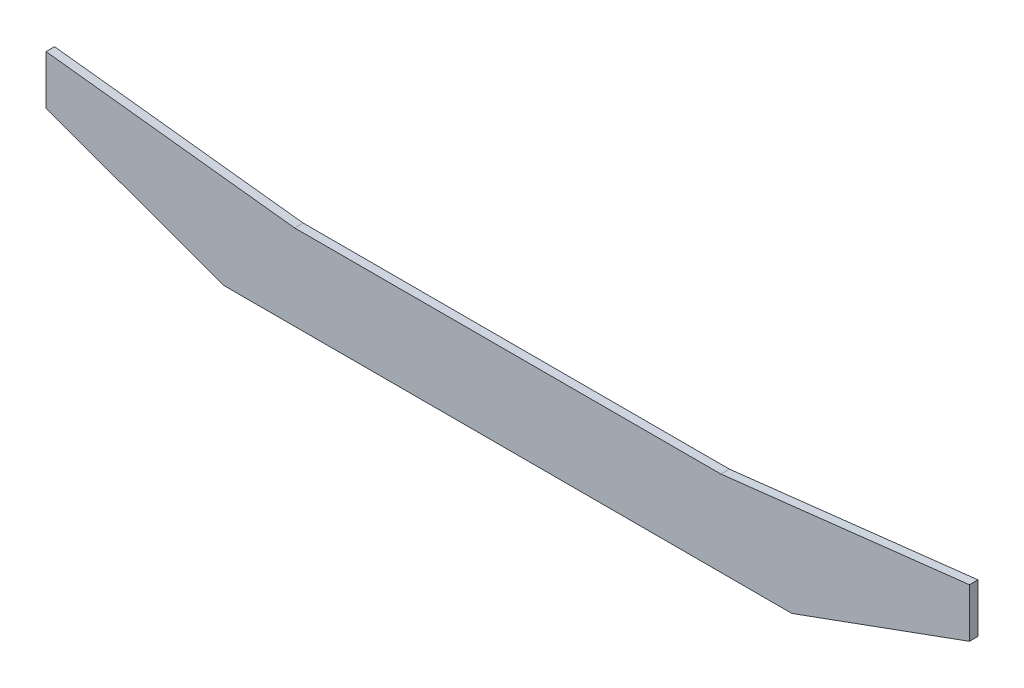
ISO-10303-21;
HEADER;
FILE_DESCRIPTION(('STEP AP214'),'2;1');
FILE_NAME('part.step','',(''),(''),'','','');
FILE_SCHEMA(('AUTOMOTIVE_DESIGN { 1 0 10303 214 1 1 1 1 }'));
ENDSEC;
DATA;
#1=APPLICATION_CONTEXT('core data for automotive mechanical design processes');
#2=APPLICATION_PROTOCOL_DEFINITION('international standard','automotive_design',2000,#1);
#3=PRODUCT_CONTEXT('',#1,'mechanical');
#4=PRODUCT('Part','Part','',(#3));
#5=PRODUCT_RELATED_PRODUCT_CATEGORY('part','',(#4));
#6=PRODUCT_DEFINITION_FORMATION('','',#4);
#7=PRODUCT_DEFINITION_CONTEXT('part definition',#1,'design');
#8=PRODUCT_DEFINITION('design','',#6,#7);
#9=PRODUCT_DEFINITION_SHAPE('','',#8);
#10=(LENGTH_UNIT() NAMED_UNIT(*) SI_UNIT(.MILLI.,.METRE.));
#11=(NAMED_UNIT(*) PLANE_ANGLE_UNIT() SI_UNIT($,.RADIAN.));
#12=(NAMED_UNIT(*) SI_UNIT($,.STERADIAN.) SOLID_ANGLE_UNIT());
#13=UNCERTAINTY_MEASURE_WITH_UNIT(LENGTH_MEASURE(1.E-05),#10,'distance_accuracy_value','');
#14=(GEOMETRIC_REPRESENTATION_CONTEXT(3) GLOBAL_UNCERTAINTY_ASSIGNED_CONTEXT((#13)) GLOBAL_UNIT_ASSIGNED_CONTEXT((#10,
#11,#12)) REPRESENTATION_CONTEXT('',''));
#15=CARTESIAN_POINT('',(0.,0.,0.));
#16=DIRECTION('',(0.,0.,1.));
#17=DIRECTION('',(1.,0.,0.));
#18=AXIS2_PLACEMENT_3D('',#15,#16,#17);
#19=CARTESIAN_POINT('',(-325.,79.9999999999999,6.));
#20=DIRECTION('',(-0.113546591160732,-0.993532672656404,0.));
#21=DIRECTION('',(0.993532672656404,-0.113546591160732,0.));
#22=AXIS2_PLACEMENT_3D('',#19,#20,#21);
#23=PLANE('',#22);
#24=DIRECTION('',(-0.993532672656404,0.113546591160732,0.));
#25=VECTOR('',#24,1.);
#26=CARTESIAN_POINT('',(-325.,79.9999999999999,0.));
#27=LINE('',#26,#25);
#28=CARTESIAN_POINT('',(-150.,60.,0.));
#29=VERTEX_POINT('',#28);
#30=CARTESIAN_POINT('',(-325.,79.9999999999999,0.));
#31=VERTEX_POINT('',#30);
#32=EDGE_CURVE('E131',#29,#31,#27,.T.);
#33=ORIENTED_EDGE('',*,*,#32,.T.);
#34=DIRECTION('',(0.,0.,-1.));
#35=VECTOR('',#34,1.);
#36=CARTESIAN_POINT('',(-325.,79.9999999999999,6.));
#37=LINE('',#36,#35);
#38=CARTESIAN_POINT('',(-325.,79.9999999999999,6.));
#39=VERTEX_POINT('',#38);
#40=EDGE_CURVE('E11',#39,#31,#37,.T.);
#41=ORIENTED_EDGE('',*,*,#40,.F.);
#42=DIRECTION('',(-0.993532672656404,0.113546591160732,0.));
#43=VECTOR('',#42,1.);
#44=CARTESIAN_POINT('',(-325.,79.9999999999999,6.));
#45=LINE('',#44,#43);
#46=CARTESIAN_POINT('',(-150.,60.,6.));
#47=VERTEX_POINT('',#46);
#48=EDGE_CURVE('E145',#47,#39,#45,.T.);
#49=ORIENTED_EDGE('',*,*,#48,.F.);
#50=DIRECTION('',(0.,0.,-1.));
#51=VECTOR('',#50,1.);
#52=CARTESIAN_POINT('',(-150.,60.,6.));
#53=LINE('',#52,#51);
#54=EDGE_CURVE('E127',#47,#29,#53,.T.);
#55=ORIENTED_EDGE('',*,*,#54,.T.);
#56=EDGE_LOOP('',(#33,#41,#49,#55));
#57=FACE_BOUND('',#56,.T.);
#58=ADVANCED_FACE('F35',(#57),#23,.F.);
#59=CARTESIAN_POINT('',(-325.,79.9999999999999,6.));
#60=DIRECTION('',(1.,0.,0.));
#61=DIRECTION('',(0.,1.,0.));
#62=AXIS2_PLACEMENT_3D('',#59,#60,#61);
#63=PLANE('',#62);
#64=DIRECTION('',(0.,-1.,0.));
#65=VECTOR('',#64,1.);
#66=CARTESIAN_POINT('',(-325.,79.9999999999999,0.));
#67=LINE('',#66,#65);
#68=CARTESIAN_POINT('',(-325.,45.4962792832754,0.));
#69=VERTEX_POINT('',#68);
#70=EDGE_CURVE('E134',#31,#69,#67,.T.);
#71=ORIENTED_EDGE('',*,*,#70,.T.);
#72=DIRECTION('',(0.,0.,-1.));
#73=VECTOR('',#72,1.);
#74=CARTESIAN_POINT('',(-325.,45.4962792832754,6.));
#75=LINE('',#74,#73);
#76=CARTESIAN_POINT('',(-325.,45.4962792832754,6.));
#77=VERTEX_POINT('',#76);
#78=EDGE_CURVE('E43',#77,#69,#75,.T.);
#79=ORIENTED_EDGE('',*,*,#78,.F.);
#80=DIRECTION('',(0.,-1.,0.));
#81=VECTOR('',#80,1.);
#82=CARTESIAN_POINT('',(-325.,79.9999999999999,6.));
#83=LINE('',#82,#81);
#84=EDGE_CURVE('E94',#39,#77,#83,.T.);
#85=ORIENTED_EDGE('',*,*,#84,.F.);
#86=ORIENTED_EDGE('',*,*,#40,.T.);
#87=EDGE_LOOP('',(#71,#79,#85,#86));
#88=FACE_BOUND('',#87,.T.);
#89=ADVANCED_FACE('F180',(#88),#63,.F.);
#90=CARTESIAN_POINT('',(-325.,45.4962792832754,6.));
#91=DIRECTION('',(0.34202014332567,0.939692620785908,0.));
#92=DIRECTION('',(-0.939692620785908,0.34202014332567,0.));
#93=AXIS2_PLACEMENT_3D('',#90,#91,#92);
#94=PLANE('',#93);
#95=DIRECTION('',(0.939692620785908,-0.34202014332567,0.));
#96=VECTOR('',#95,1.);
#97=CARTESIAN_POINT('',(-325.,45.4962792832754,0.));
#98=LINE('',#97,#96);
#99=CARTESIAN_POINT('',(-200.,0.,0.));
#100=VERTEX_POINT('',#99);
#101=EDGE_CURVE('E136',#69,#100,#98,.T.);
#102=ORIENTED_EDGE('',*,*,#101,.T.);
#103=DIRECTION('',(0.,0.,-1.));
#104=VECTOR('',#103,1.);
#105=CARTESIAN_POINT('',(-200.,0.,6.));
#106=LINE('',#105,#104);
#107=CARTESIAN_POINT('',(-200.,0.,6.));
#108=VERTEX_POINT('',#107);
#109=EDGE_CURVE('E152',#108,#100,#106,.T.);
#110=ORIENTED_EDGE('',*,*,#109,.F.);
#111=DIRECTION('',(0.939692620785908,-0.34202014332567,0.));
#112=VECTOR('',#111,1.);
#113=CARTESIAN_POINT('',(-325.,45.4962792832754,6.));
#114=LINE('',#113,#112);
#115=EDGE_CURVE('E160',#77,#108,#114,.T.);
#116=ORIENTED_EDGE('',*,*,#115,.F.);
#117=ORIENTED_EDGE('',*,*,#78,.T.);
#118=EDGE_LOOP('',(#102,#110,#116,#117));
#119=FACE_BOUND('',#118,.T.);
#120=ADVANCED_FACE('F158',(#119),#94,.F.);
#121=CARTESIAN_POINT('',(-200.,0.,6.));
#122=DIRECTION('',(0.,1.,0.));
#123=DIRECTION('',(0.,0.,1.));
#124=AXIS2_PLACEMENT_3D('',#121,#122,#123);
#125=PLANE('',#124);
#126=DIRECTION('',(1.,0.,0.));
#127=VECTOR('',#126,1.);
#128=CARTESIAN_POINT('',(-200.,0.,0.));
#129=LINE('',#128,#127);
#130=CARTESIAN_POINT('',(200.,0.,0.));
#131=VERTEX_POINT('',#130);
#132=EDGE_CURVE('E138',#100,#131,#129,.T.);
#133=ORIENTED_EDGE('',*,*,#132,.T.);
#134=DIRECTION('',(0.,0.,-1.));
#135=VECTOR('',#134,1.);
#136=CARTESIAN_POINT('',(200.,0.,6.));
#137=LINE('',#136,#135);
#138=CARTESIAN_POINT('',(200.,0.,6.));
#139=VERTEX_POINT('',#138);
#140=EDGE_CURVE('E149',#139,#131,#137,.T.);
#141=ORIENTED_EDGE('',*,*,#140,.F.);
#142=DIRECTION('',(1.,0.,0.));
#143=VECTOR('',#142,1.);
#144=CARTESIAN_POINT('',(-200.,0.,6.));
#145=LINE('',#144,#143);
#146=EDGE_CURVE('E172',#108,#139,#145,.T.);
#147=ORIENTED_EDGE('',*,*,#146,.F.);
#148=ORIENTED_EDGE('',*,*,#109,.T.);
#149=EDGE_LOOP('',(#133,#141,#147,#148));
#150=FACE_BOUND('',#149,.T.);
#151=ADVANCED_FACE('F168',(#150),#125,.F.);
#152=CARTESIAN_POINT('',(200.,0.,6.));
#153=DIRECTION('',(-0.34202014332567,0.939692620785908,0.));
#154=DIRECTION('',(-0.939692620785908,-0.34202014332567,0.));
#155=AXIS2_PLACEMENT_3D('',#152,#153,#154);
#156=PLANE('',#155);
#157=DIRECTION('',(0.939692620785908,0.34202014332567,0.));
#158=VECTOR('',#157,1.);
#159=CARTESIAN_POINT('',(200.,0.,0.));
#160=LINE('',#159,#158);
#161=CARTESIAN_POINT('',(325.,45.4962792832755,0.));
#162=VERTEX_POINT('',#161);
#163=EDGE_CURVE('E140',#131,#162,#160,.T.);
#164=ORIENTED_EDGE('',*,*,#163,.T.);
#165=DIRECTION('',(0.,0.,-1.));
#166=VECTOR('',#165,1.);
#167=CARTESIAN_POINT('',(325.,45.4962792832755,6.));
#168=LINE('',#167,#166);
#169=CARTESIAN_POINT('',(325.,45.4962792832755,6.));
#170=VERTEX_POINT('',#169);
#171=EDGE_CURVE('E122',#170,#162,#168,.T.);
#172=ORIENTED_EDGE('',*,*,#171,.F.);
#173=DIRECTION('',(0.939692620785908,0.34202014332567,0.));
#174=VECTOR('',#173,1.);
#175=CARTESIAN_POINT('',(200.,0.,6.));
#176=LINE('',#175,#174);
#177=EDGE_CURVE('E113',#139,#170,#176,.T.);
#178=ORIENTED_EDGE('',*,*,#177,.F.);
#179=ORIENTED_EDGE('',*,*,#140,.T.);
#180=EDGE_LOOP('',(#164,#172,#178,#179));
#181=FACE_BOUND('',#180,.T.);
#182=ADVANCED_FACE('F171',(#181),#156,.F.);
#183=CARTESIAN_POINT('',(325.,45.4962792832755,6.));
#184=DIRECTION('',(-1.,0.,0.));
#185=DIRECTION('',(0.,-1.,0.));
#186=AXIS2_PLACEMENT_3D('',#183,#184,#185);
#187=PLANE('',#186);
#188=DIRECTION('',(0.,1.,0.));
#189=VECTOR('',#188,1.);
#190=CARTESIAN_POINT('',(325.,45.4962792832755,0.));
#191=LINE('',#190,#189);
#192=CARTESIAN_POINT('',(325.,80.,0.));
#193=VERTEX_POINT('',#192);
#194=EDGE_CURVE('E121',#162,#193,#191,.T.);
#195=ORIENTED_EDGE('',*,*,#194,.T.);
#196=DIRECTION('',(0.,0.,-1.));
#197=VECTOR('',#196,1.);
#198=CARTESIAN_POINT('',(325.,80.,6.));
#199=LINE('',#198,#197);
#200=CARTESIAN_POINT('',(325.,80.,6.));
#201=VERTEX_POINT('',#200);
#202=EDGE_CURVE('E118',#201,#193,#199,.T.);
#203=ORIENTED_EDGE('',*,*,#202,.F.);
#204=DIRECTION('',(0.,1.,0.));
#205=VECTOR('',#204,1.);
#206=CARTESIAN_POINT('',(325.,45.4962792832755,6.));
#207=LINE('',#206,#205);
#208=EDGE_CURVE('E107',#170,#201,#207,.T.);
#209=ORIENTED_EDGE('',*,*,#208,.F.);
#210=ORIENTED_EDGE('',*,*,#171,.T.);
#211=EDGE_LOOP('',(#195,#203,#209,#210));
#212=FACE_BOUND('',#211,.T.);
#213=ADVANCED_FACE('F119',(#212),#187,.F.);
#214=CARTESIAN_POINT('',(150.,60.,6.));
#215=DIRECTION('',(0.113546591160732,-0.993532672656404,0.));
#216=DIRECTION('',(0.993532672656404,0.113546591160732,0.));
#217=AXIS2_PLACEMENT_3D('',#214,#215,#216);
#218=PLANE('',#217);
#219=DIRECTION('',(-0.993532672656404,-0.113546591160732,0.));
#220=VECTOR('',#219,1.);
#221=CARTESIAN_POINT('',(150.,60.,0.));
#222=LINE('',#221,#220);
#223=CARTESIAN_POINT('',(150.,60.,0.));
#224=VERTEX_POINT('',#223);
#225=EDGE_CURVE('E80',#193,#224,#222,.T.);
#226=ORIENTED_EDGE('',*,*,#225,.T.);
#227=DIRECTION('',(0.,0.,-1.));
#228=VECTOR('',#227,1.);
#229=CARTESIAN_POINT('',(150.,60.,6.));
#230=LINE('',#229,#228);
#231=CARTESIAN_POINT('',(150.,60.,6.));
#232=VERTEX_POINT('',#231);
#233=EDGE_CURVE('E123',#232,#224,#230,.T.);
#234=ORIENTED_EDGE('',*,*,#233,.F.);
#235=DIRECTION('',(-0.993532672656404,-0.113546591160732,0.));
#236=VECTOR('',#235,1.);
#237=CARTESIAN_POINT('',(150.,60.,6.));
#238=LINE('',#237,#236);
#239=EDGE_CURVE('E111',#201,#232,#238,.T.);
#240=ORIENTED_EDGE('',*,*,#239,.F.);
#241=ORIENTED_EDGE('',*,*,#202,.T.);
#242=EDGE_LOOP('',(#226,#234,#240,#241));
#243=FACE_BOUND('',#242,.T.);
#244=ADVANCED_FACE('F125',(#243),#218,.F.);
#245=CARTESIAN_POINT('',(-150.,60.,6.));
#246=DIRECTION('',(0.,-1.,0.));
#247=DIRECTION('',(0.,0.,-1.));
#248=AXIS2_PLACEMENT_3D('',#245,#246,#247);
#249=PLANE('',#248);
#250=DIRECTION('',(-1.,0.,0.));
#251=VECTOR('',#250,1.);
#252=CARTESIAN_POINT('',(-150.,60.,0.));
#253=LINE('',#252,#251);
#254=EDGE_CURVE('E86',#224,#29,#253,.T.);
#255=ORIENTED_EDGE('',*,*,#254,.T.);
#256=ORIENTED_EDGE('',*,*,#54,.F.);
#257=DIRECTION('',(-1.,0.,0.));
#258=VECTOR('',#257,1.);
#259=CARTESIAN_POINT('',(-150.,60.,6.));
#260=LINE('',#259,#258);
#261=EDGE_CURVE('E51',#232,#47,#260,.T.);
#262=ORIENTED_EDGE('',*,*,#261,.F.);
#263=ORIENTED_EDGE('',*,*,#233,.T.);
#264=EDGE_LOOP('',(#255,#256,#262,#263));
#265=FACE_BOUND('',#264,.T.);
#266=ADVANCED_FACE('F196',(#265),#249,.F.);
#267=CARTESIAN_POINT('',(0.,0.,6.));
#268=DIRECTION('',(0.,0.,1.));
#269=DIRECTION('',(1.,0.,0.));
#270=AXIS2_PLACEMENT_3D('',#267,#268,#269);
#271=PLANE('',#270);
#272=ORIENTED_EDGE('',*,*,#48,.T.);
#273=ORIENTED_EDGE('',*,*,#84,.T.);
#274=ORIENTED_EDGE('',*,*,#115,.T.);
#275=ORIENTED_EDGE('',*,*,#146,.T.);
#276=ORIENTED_EDGE('',*,*,#177,.T.);
#277=ORIENTED_EDGE('',*,*,#208,.T.);
#278=ORIENTED_EDGE('',*,*,#239,.T.);
#279=ORIENTED_EDGE('',*,*,#261,.T.);
#280=EDGE_LOOP('',(#272,#273,#274,#275,#276,#277,#278,#279));
#281=FACE_BOUND('',#280,.T.);
#282=ADVANCED_FACE('F109',(#281),#271,.T.);
#283=CARTESIAN_POINT('',(0.,0.,0.));
#284=DIRECTION('',(0.,0.,1.));
#285=DIRECTION('',(1.,0.,0.));
#286=AXIS2_PLACEMENT_3D('',#283,#284,#285);
#287=PLANE('',#286);
#288=ORIENTED_EDGE('',*,*,#32,.F.);
#289=ORIENTED_EDGE('',*,*,#254,.F.);
#290=ORIENTED_EDGE('',*,*,#225,.F.);
#291=ORIENTED_EDGE('',*,*,#194,.F.);
#292=ORIENTED_EDGE('',*,*,#163,.F.);
#293=ORIENTED_EDGE('',*,*,#132,.F.);
#294=ORIENTED_EDGE('',*,*,#101,.F.);
#295=ORIENTED_EDGE('',*,*,#70,.F.);
#296=EDGE_LOOP('',(#288,#289,#290,#291,#292,#293,#294,#295));
#297=FACE_BOUND('',#296,.T.);
#298=ADVANCED_FACE('F164',(#297),#287,.F.);
#299=CLOSED_SHELL('',(#58,#89,#120,#151,#182,#213,#244,#266,#282,#298));
#300=MANIFOLD_SOLID_BREP('B2',#299);
#301=ADVANCED_BREP_SHAPE_REPRESENTATION('',(#18,#300),#14);
#302=SHAPE_DEFINITION_REPRESENTATION(#9,#301);
ENDSEC;
END-ISO-10303-21;
